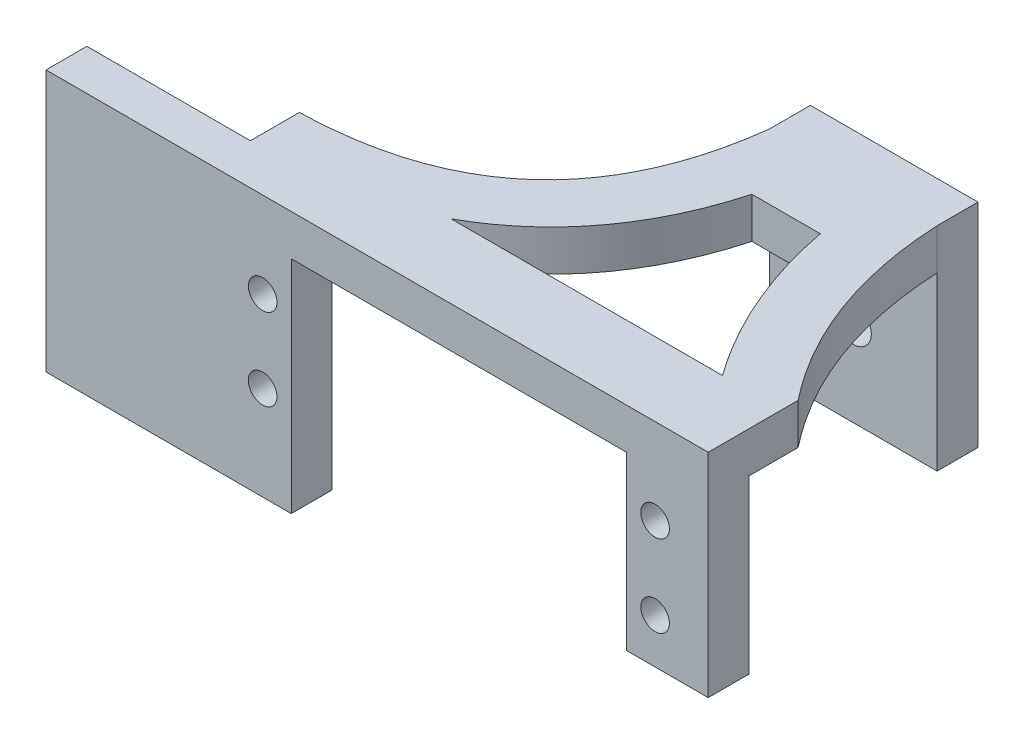
ISO-10303-21;
HEADER;
FILE_DESCRIPTION(('STEP AP214'),'2;1');
FILE_NAME('part.step','',(''),(''),'','','');
FILE_SCHEMA(('AUTOMOTIVE_DESIGN { 1 0 10303 214 1 1 1 1 }'));
ENDSEC;
DATA;
#1=APPLICATION_CONTEXT('core data for automotive mechanical design processes');
#2=APPLICATION_PROTOCOL_DEFINITION('international standard','automotive_design',2000,#1);
#3=PRODUCT_CONTEXT('',#1,'mechanical');
#4=PRODUCT('Part','Part','',(#3));
#5=PRODUCT_RELATED_PRODUCT_CATEGORY('part','',(#4));
#6=PRODUCT_DEFINITION_FORMATION('','',#4);
#7=PRODUCT_DEFINITION_CONTEXT('part definition',#1,'design');
#8=PRODUCT_DEFINITION('design','',#6,#7);
#9=PRODUCT_DEFINITION_SHAPE('','',#8);
#10=(LENGTH_UNIT() NAMED_UNIT(*) SI_UNIT(.MILLI.,.METRE.));
#11=(NAMED_UNIT(*) PLANE_ANGLE_UNIT() SI_UNIT($,.RADIAN.));
#12=(NAMED_UNIT(*) SI_UNIT($,.STERADIAN.) SOLID_ANGLE_UNIT());
#13=UNCERTAINTY_MEASURE_WITH_UNIT(LENGTH_MEASURE(1.E-05),#10,'distance_accuracy_value','');
#14=(GEOMETRIC_REPRESENTATION_CONTEXT(3) GLOBAL_UNCERTAINTY_ASSIGNED_CONTEXT((#13)) GLOBAL_UNIT_ASSIGNED_CONTEXT((#10,
#11,#12)) REPRESENTATION_CONTEXT('',''));
#15=CARTESIAN_POINT('',(0.,0.,0.));
#16=DIRECTION('',(0.,0.,1.));
#17=DIRECTION('',(1.,0.,0.));
#18=AXIS2_PLACEMENT_3D('',#15,#16,#17);
#19=CARTESIAN_POINT('',(-5.,21.,2.5));
#20=DIRECTION('',(1.,0.,0.));
#21=DIRECTION('',(0.,0.,-1.));
#22=AXIS2_PLACEMENT_3D('',#19,#20,#21);
#23=PLANE('',#22);
#24=DIRECTION('',(0.,-1.,0.));
#25=VECTOR('',#24,1.);
#26=CARTESIAN_POINT('',(-5.,-6.,-2.5));
#27=LINE('',#26,#25);
#28=CARTESIAN_POINT('',(-5.,26.,-2.5));
#29=VERTEX_POINT('',#28);
#30=CARTESIAN_POINT('',(-5.,21.,-2.5));
#31=VERTEX_POINT('',#30);
#32=EDGE_CURVE('E125',#29,#31,#27,.T.);
#33=ORIENTED_EDGE('',*,*,#32,.F.);
#34=DIRECTION('',(0.,0.,1.));
#35=VECTOR('',#34,1.);
#36=CARTESIAN_POINT('',(-5.,26.,-40.5));
#37=LINE('',#36,#35);
#38=CARTESIAN_POINT('',(-5.,26.,-8.5));
#39=VERTEX_POINT('',#38);
#40=EDGE_CURVE('E462',#39,#29,#37,.T.);
#41=ORIENTED_EDGE('',*,*,#40,.F.);
#42=DIRECTION('',(0.,-1.,0.));
#43=VECTOR('',#42,1.);
#44=CARTESIAN_POINT('',(-5.,26.001,-8.5));
#45=LINE('',#44,#43);
#46=CARTESIAN_POINT('',(-5.,21.,-8.5));
#47=VERTEX_POINT('',#46);
#48=EDGE_CURVE('E369',#39,#47,#45,.T.);
#49=ORIENTED_EDGE('',*,*,#48,.T.);
#50=DIRECTION('',(0.,0.,1.));
#51=VECTOR('',#50,1.);
#52=CARTESIAN_POINT('',(-5.,21.,-40.5));
#53=LINE('',#52,#51);
#54=EDGE_CURVE('E461',#47,#31,#53,.T.);
#55=ORIENTED_EDGE('',*,*,#54,.T.);
#56=EDGE_LOOP('',(#33,#41,#49,#55));
#57=FACE_BOUND('',#56,.T.);
#58=ADVANCED_FACE('F110',(#57),#23,.F.);
#59=CARTESIAN_POINT('',(0.,21.,0.));
#60=DIRECTION('',(0.,1.,0.));
#61=DIRECTION('',(0.,0.,1.));
#62=AXIS2_PLACEMENT_3D('',#59,#60,#61);
#63=PLANE('',#62);
#64=CARTESIAN_POINT('',(38.7838628851176,21.,-35.114936140948));
#65=CARTESIAN_POINT('',(38.8652918877911,21.,-33.6852308442561));
#66=CARTESIAN_POINT('',(39.1304437659804,21.,-30.8162649095763));
#67=CARTESIAN_POINT('',(40.0657359277435,21.,-25.2463809760036));
#68=CARTESIAN_POINT('',(42.0094454296501,21.,-18.532642769764));
#69=CARTESIAN_POINT('',(44.9880888737021,21.,-12.248553285696));
#70=CARTESIAN_POINT('',(47.9623960815902,21.,-7.52591231067879));
#71=CARTESIAN_POINT('',(49.6508214629412,21.,-5.25850875930615));
#72=CARTESIAN_POINT('',(50.5332752535796,21.,-4.16214311814657));
#73=B_SPLINE_CURVE_WITH_KNOTS('',3,(#64,#65,#66,#67,#68,#69,#70,#71,#72),.UNSPECIFIED.,.F.,.F.,
(4,1,1,1,1,1,4),(0.,0.125,0.25,0.5,0.75,0.875,1.),.UNSPECIFIED.);
#74=CARTESIAN_POINT('',(39.7152079045657,21.,-27.5));
#75=VERTEX_POINT('',#74);
#76=CARTESIAN_POINT('',(48.7510362250685,21.,-6.5));
#77=VERTEX_POINT('',#76);
#78=EDGE_CURVE('E544',#75,#77,#73,.T.);
#79=ORIENTED_EDGE('',*,*,#78,.F.);
#80=DIRECTION('',(1.,0.,0.));
#81=VECTOR('',#80,1.);
#82=CARTESIAN_POINT('',(0.,21.,-27.5));
#83=LINE('',#82,#81);
#84=CARTESIAN_POINT('',(31.3438963494135,21.,-27.5));
#85=VERTEX_POINT('',#84);
#86=EDGE_CURVE('E133',#85,#75,#83,.T.);
#87=ORIENTED_EDGE('',*,*,#86,.F.);
#88=CARTESIAN_POINT('',(32.73683878152,21.,-34.5383919550423));
#89=CARTESIAN_POINT('',(32.5797981224586,21.,-33.3230631134089));
#90=CARTESIAN_POINT('',(32.1839084465509,21.,-30.8762568893279));
#91=CARTESIAN_POINT('',(31.092947724213,21.,-26.2509816916951));
#92=CARTESIAN_POINT('',(29.1168839979073,21.,-20.8255396942699));
#93=CARTESIAN_POINT('',(25.6747922132707,21.,-15.0245460899033));
#94=CARTESIAN_POINT('',(21.1403736095319,21.,-10.111116834161));
#95=CARTESIAN_POINT('',(15.6453147543688,21.,-6.28918660899113));
#96=CARTESIAN_POINT('',(10.4487369566814,21.,-4.07506504000657));
#97=CARTESIAN_POINT('',(6.00171909105598,21.,-2.85509985059111));
#98=CARTESIAN_POINT('',(2.53152841911866,21.,-2.2019378239847));
#99=CARTESIAN_POINT('',(-0.471207100711964,21.,-1.86496619572558));
#100=CARTESIAN_POINT('',(-2.93304743004251,21.,-1.71384560274864));
#101=CARTESIAN_POINT('',(-4.19526220151115,21.,-1.6767410135728));
#102=CARTESIAN_POINT('',(-4.82277343746924,21.,-1.66776347679863));
#103=B_SPLINE_CURVE_WITH_KNOTS('',3,(#88,#89,#90,#91,#92,#93,#94,#95,#96,#97,#98,#99,#100,#101,
#102),.UNSPECIFIED.,.F.,.F.,(4,1,1,1,1,1,1,1,1,1,1,1,4),(0.,0.0625,0.125,0.25,0.375,0.5,0.625,
0.75,0.8125,0.875,0.9375,0.96875,1.),.UNSPECIFIED.);
#104=CARTESIAN_POINT('',(15.5519508130954,21.,-6.5));
#105=VERTEX_POINT('',#104);
#106=EDGE_CURVE('E531',#85,#105,#103,.T.);
#107=ORIENTED_EDGE('',*,*,#106,.T.);
#108=DIRECTION('',(-1.,0.,0.));
#109=VECTOR('',#108,1.);
#110=CARTESIAN_POINT('',(0.,21.,-6.5));
#111=LINE('',#110,#109);
#112=EDGE_CURVE('E538',#77,#105,#111,.T.);
#113=ORIENTED_EDGE('',*,*,#112,.F.);
#114=EDGE_LOOP('',(#79,#87,#107,#113));
#115=FACE_BOUND('',#114,.T.);
#116=CARTESIAN_POINT('',(46.,21.,-35.5));
#117=CARTESIAN_POINT('',(46.7615392515143,21.,-20.1514583464889));
#118=CARTESIAN_POINT('',(56.,21.,-8.49999999999999));
#119=B_SPLINE_CURVE_WITH_KNOTS('',2,(#116,#117,#118),.UNSPECIFIED.,.F.,.F.,(3,3),(0.,1.),.UNSPECIFIED.);
#120=CARTESIAN_POINT('',(46.,21.,-35.5));
#121=VERTEX_POINT('',#120);
#122=CARTESIAN_POINT('',(56.,21.,-8.49999999999999));
#123=VERTEX_POINT('',#122);
#124=EDGE_CURVE('E336',#121,#123,#119,.T.);
#125=ORIENTED_EDGE('',*,*,#124,.T.);
#126=DIRECTION('',(0.,0.,-1.));
#127=VECTOR('',#126,1.);
#128=CARTESIAN_POINT('',(56.,21.,2.5));
#129=LINE('',#128,#127);
#130=CARTESIAN_POINT('',(56.,21.,-2.5));
#131=VERTEX_POINT('',#130);
#132=EDGE_CURVE('E465',#131,#123,#129,.T.);
#133=ORIENTED_EDGE('',*,*,#132,.F.);
#134=DIRECTION('',(-1.,0.,0.));
#135=VECTOR('',#134,1.);
#136=CARTESIAN_POINT('',(46.,21.,-2.5));
#137=LINE('',#136,#135);
#138=CARTESIAN_POINT('',(46.,21.,-2.5));
#139=VERTEX_POINT('',#138);
#140=EDGE_CURVE('E437',#131,#139,#137,.T.);
#141=ORIENTED_EDGE('',*,*,#140,.T.);
#142=DIRECTION('',(0.,0.,1.));
#143=VECTOR('',#142,1.);
#144=CARTESIAN_POINT('',(46.,21.,2.5));
#145=LINE('',#144,#143);
#146=CARTESIAN_POINT('',(46.,21.,2.5));
#147=VERTEX_POINT('',#146);
#148=EDGE_CURVE('E440',#139,#147,#145,.T.);
#149=ORIENTED_EDGE('',*,*,#148,.T.);
#150=DIRECTION('',(1.,0.,0.));
#151=VECTOR('',#150,1.);
#152=CARTESIAN_POINT('',(-5.,21.,2.5));
#153=LINE('',#152,#151);
#154=CARTESIAN_POINT('',(5.,21.,2.5));
#155=VERTEX_POINT('',#154);
#156=EDGE_CURVE('E475',#155,#147,#153,.T.);
#157=ORIENTED_EDGE('',*,*,#156,.F.);
#158=DIRECTION('',(0.,0.,-1.));
#159=VECTOR('',#158,1.);
#160=CARTESIAN_POINT('',(5.,21.,2.5));
#161=LINE('',#160,#159);
#162=CARTESIAN_POINT('',(5.,21.,-2.5));
#163=VERTEX_POINT('',#162);
#164=EDGE_CURVE('E481',#155,#163,#161,.T.);
#165=ORIENTED_EDGE('',*,*,#164,.T.);
#166=DIRECTION('',(-1.,0.,0.));
#167=VECTOR('',#166,1.);
#168=CARTESIAN_POINT('',(-5.,21.,-2.5));
#169=LINE('',#168,#167);
#170=EDGE_CURVE('E253',#163,#31,#169,.T.);
#171=ORIENTED_EDGE('',*,*,#170,.T.);
#172=ORIENTED_EDGE('',*,*,#54,.F.);
#173=CARTESIAN_POINT('',(25.5,21.,-35.5));
#174=CARTESIAN_POINT('',(22.3071940127314,21.,-9.11182757343748));
#175=CARTESIAN_POINT('',(-5.,21.,-8.5));
#176=B_SPLINE_CURVE_WITH_KNOTS('',2,(#173,#174,#175),.UNSPECIFIED.,.F.,.F.,(3,3),(0.,1.),.UNSPECIFIED.);
#177=CARTESIAN_POINT('',(25.5,21.,-35.5));
#178=VERTEX_POINT('',#177);
#179=EDGE_CURVE('E357',#178,#47,#176,.T.);
#180=ORIENTED_EDGE('',*,*,#179,.F.);
#181=DIRECTION('',(-1.,0.,0.));
#182=VECTOR('',#181,1.);
#183=CARTESIAN_POINT('',(46.,21.,-35.5));
#184=LINE('',#183,#182);
#185=EDGE_CURVE('E414',#121,#178,#184,.T.);
#186=ORIENTED_EDGE('',*,*,#185,.F.);
#187=EDGE_LOOP('',(#125,#133,#141,#149,#157,#165,#171,#172,#180,#186));
#188=FACE_BOUND('',#187,.T.);
#189=ADVANCED_FACE('F485',(#115,#188),#63,.F.);
#190=CARTESIAN_POINT('',(56.,26.,2.5));
#191=DIRECTION('',(-1.,0.,0.));
#192=DIRECTION('',(0.,0.,1.));
#193=AXIS2_PLACEMENT_3D('',#190,#191,#192);
#194=PLANE('',#193);
#195=DIRECTION('',(0.,-1.,0.));
#196=VECTOR('',#195,1.);
#197=CARTESIAN_POINT('',(56.,26.001,-8.49999999999999));
#198=LINE('',#197,#196);
#199=CARTESIAN_POINT('',(56.,26.,-8.49999999999999));
#200=VERTEX_POINT('',#199);
#201=EDGE_CURVE('E345',#200,#123,#198,.T.);
#202=ORIENTED_EDGE('',*,*,#201,.F.);
#203=DIRECTION('',(0.,0.,-1.));
#204=VECTOR('',#203,1.);
#205=CARTESIAN_POINT('',(56.,26.,2.5));
#206=LINE('',#205,#204);
#207=CARTESIAN_POINT('',(56.,26.,2.5));
#208=VERTEX_POINT('',#207);
#209=EDGE_CURVE('E467',#208,#200,#206,.T.);
#210=ORIENTED_EDGE('',*,*,#209,.F.);
#211=DIRECTION('',(0.,-1.,0.));
#212=VECTOR('',#211,1.);
#213=CARTESIAN_POINT('',(56.,26.,2.5));
#214=LINE('',#213,#212);
#215=CARTESIAN_POINT('',(56.,0.,2.5));
#216=VERTEX_POINT('',#215);
#217=EDGE_CURVE('E473',#208,#216,#214,.T.);
#218=ORIENTED_EDGE('',*,*,#217,.T.);
#219=DIRECTION('',(0.,0.,-1.));
#220=VECTOR('',#219,1.);
#221=CARTESIAN_POINT('',(56.,0.,2.5));
#222=LINE('',#221,#220);
#223=CARTESIAN_POINT('',(56.,0.,-2.5));
#224=VERTEX_POINT('',#223);
#225=EDGE_CURVE('E436',#216,#224,#222,.T.);
#226=ORIENTED_EDGE('',*,*,#225,.T.);
#227=DIRECTION('',(0.,-1.,0.));
#228=VECTOR('',#227,1.);
#229=CARTESIAN_POINT('',(56.,21.,-2.5));
#230=LINE('',#229,#228);
#231=EDGE_CURVE('E458',#131,#224,#230,.T.);
#232=ORIENTED_EDGE('',*,*,#231,.F.);
#233=ORIENTED_EDGE('',*,*,#132,.T.);
#234=EDGE_LOOP('',(#202,#210,#218,#226,#232,#233));
#235=FACE_BOUND('',#234,.T.);
#236=ADVANCED_FACE('F571',(#235),#194,.F.);
#237=CARTESIAN_POINT('',(0.,26.,0.));
#238=DIRECTION('',(0.,1.,0.));
#239=DIRECTION('',(0.,0.,1.));
#240=AXIS2_PLACEMENT_3D('',#237,#238,#239);
#241=PLANE('',#240);
#242=DIRECTION('',(1.,0.,0.));
#243=VECTOR('',#242,1.);
#244=CARTESIAN_POINT('',(0.,26.,-27.5));
#245=LINE('',#244,#243);
#246=CARTESIAN_POINT('',(31.3438963494135,26.,-27.5));
#247=VERTEX_POINT('',#246);
#248=CARTESIAN_POINT('',(39.7152079045657,26.,-27.5));
#249=VERTEX_POINT('',#248);
#250=EDGE_CURVE('E290',#247,#249,#245,.T.);
#251=ORIENTED_EDGE('',*,*,#250,.T.);
#252=CARTESIAN_POINT('',(38.7838628851176,26.,-35.114936140948));
#253=CARTESIAN_POINT('',(38.8652918877911,26.,-33.6852308442561));
#254=CARTESIAN_POINT('',(39.1304437659804,26.,-30.8162649095763));
#255=CARTESIAN_POINT('',(40.0657359277435,26.,-25.2463809760036));
#256=CARTESIAN_POINT('',(42.0094454296501,26.,-18.532642769764));
#257=CARTESIAN_POINT('',(44.9880888737021,26.,-12.248553285696));
#258=CARTESIAN_POINT('',(47.9623960815902,26.,-7.52591231067879));
#259=CARTESIAN_POINT('',(49.6508214629412,26.,-5.25850875930615));
#260=CARTESIAN_POINT('',(50.5332752535796,26.,-4.16214311814657));
#261=B_SPLINE_CURVE_WITH_KNOTS('',3,(#252,#253,#254,#255,#256,#257,#258,#259,#260),
.UNSPECIFIED.,.F.,.F.,(4,1,1,1,1,1,4),(0.,0.125,0.25,0.5,0.75,0.875,1.),.UNSPECIFIED.);
#262=CARTESIAN_POINT('',(48.7510362250686,26.,-6.5));
#263=VERTEX_POINT('',#262);
#264=EDGE_CURVE('E516',#249,#263,#261,.T.);
#265=ORIENTED_EDGE('',*,*,#264,.T.);
#266=DIRECTION('',(-1.,0.,0.));
#267=VECTOR('',#266,1.);
#268=CARTESIAN_POINT('',(0.,26.,-6.5));
#269=LINE('',#268,#267);
#270=CARTESIAN_POINT('',(15.5519508130954,26.,-6.5));
#271=VERTEX_POINT('',#270);
#272=EDGE_CURVE('E265',#263,#271,#269,.T.);
#273=ORIENTED_EDGE('',*,*,#272,.T.);
#274=CARTESIAN_POINT('',(32.73683878152,26.,-34.5383919550423));
#275=CARTESIAN_POINT('',(32.5797981224586,26.,-33.3230631134089));
#276=CARTESIAN_POINT('',(32.1839084465509,26.,-30.8762568893279));
#277=CARTESIAN_POINT('',(31.092947724213,26.,-26.2509816916951));
#278=CARTESIAN_POINT('',(29.1168839979073,26.,-20.8255396942699));
#279=CARTESIAN_POINT('',(25.6747922132707,26.,-15.0245460899033));
#280=CARTESIAN_POINT('',(21.1403736095319,26.,-10.111116834161));
#281=CARTESIAN_POINT('',(15.6453147543688,26.,-6.28918660899113));
#282=CARTESIAN_POINT('',(10.4487369566814,26.,-4.07506504000657));
#283=CARTESIAN_POINT('',(6.00171909105598,26.,-2.85509985059111));
#284=CARTESIAN_POINT('',(2.53152841911866,26.,-2.2019378239847));
#285=CARTESIAN_POINT('',(-0.471207100711964,26.,-1.86496619572558));
#286=CARTESIAN_POINT('',(-2.93304743004251,26.,-1.71384560274864));
#287=CARTESIAN_POINT('',(-4.19526220151115,26.,-1.6767410135728));
#288=CARTESIAN_POINT('',(-4.82277343746924,26.,-1.66776347679863));
#289=B_SPLINE_CURVE_WITH_KNOTS('',3,(#274,#275,#276,#277,#278,#279,#280,#281,#282,#283,#284,
#285,#286,#287,#288),.UNSPECIFIED.,.F.,.F.,(4,1,1,1,1,1,1,1,1,1,1,1,4),(0.,0.0625,0.125,0.25,
0.375,0.5,0.625,0.75,0.8125,0.875,0.9375,0.96875,1.),.UNSPECIFIED.);
#290=EDGE_CURVE('E286',#247,#271,#289,.T.);
#291=ORIENTED_EDGE('',*,*,#290,.F.);
#292=EDGE_LOOP('',(#251,#265,#273,#291));
#293=FACE_BOUND('',#292,.T.);
#294=ORIENTED_EDGE('',*,*,#209,.T.);
#295=CARTESIAN_POINT('',(46.,26.,-35.5));
#296=CARTESIAN_POINT('',(46.7615392515143,26.,-20.1514583464889));
#297=CARTESIAN_POINT('',(56.,26.,-8.49999999999999));
#298=B_SPLINE_CURVE_WITH_KNOTS('',2,(#295,#296,#297),.UNSPECIFIED.,.F.,.F.,(3,3),(0.,1.),.UNSPECIFIED.);
#299=CARTESIAN_POINT('',(46.,26.,-35.5));
#300=VERTEX_POINT('',#299);
#301=EDGE_CURVE('E332',#300,#200,#298,.T.);
#302=ORIENTED_EDGE('',*,*,#301,.F.);
#303=DIRECTION('',(0.,0.,-1.));
#304=VECTOR('',#303,1.);
#305=CARTESIAN_POINT('',(46.,26.,0.));
#306=LINE('',#305,#304);
#307=CARTESIAN_POINT('',(46.,26.,-40.5));
#308=VERTEX_POINT('',#307);
#309=EDGE_CURVE('E350',#300,#308,#306,.T.);
#310=ORIENTED_EDGE('',*,*,#309,.T.);
#311=DIRECTION('',(-1.,0.,0.));
#312=VECTOR('',#311,1.);
#313=CARTESIAN_POINT('',(56.,26.,-40.5));
#314=LINE('',#313,#312);
#315=CARTESIAN_POINT('',(25.5,26.,-40.5));
#316=VERTEX_POINT('',#315);
#317=EDGE_CURVE('E470',#308,#316,#314,.T.);
#318=ORIENTED_EDGE('',*,*,#317,.T.);
#319=DIRECTION('',(0.,0.,1.));
#320=VECTOR('',#319,1.);
#321=CARTESIAN_POINT('',(25.5,26.,0.));
#322=LINE('',#321,#320);
#323=CARTESIAN_POINT('',(25.5,26.,-35.5));
#324=VERTEX_POINT('',#323);
#325=EDGE_CURVE('E355',#316,#324,#322,.T.);
#326=ORIENTED_EDGE('',*,*,#325,.T.);
#327=CARTESIAN_POINT('',(25.5,26.,-35.5));
#328=CARTESIAN_POINT('',(22.3071940127314,26.,-9.11182757343748));
#329=CARTESIAN_POINT('',(-5.,26.,-8.5));
#330=B_SPLINE_CURVE_WITH_KNOTS('',2,(#327,#328,#329),.UNSPECIFIED.,.F.,.F.,(3,3),(0.,1.),.UNSPECIFIED.);
#331=EDGE_CURVE('E375',#324,#39,#330,.T.);
#332=ORIENTED_EDGE('',*,*,#331,.T.);
#333=ORIENTED_EDGE('',*,*,#40,.T.);
#334=DIRECTION('',(1.,0.,0.));
#335=VECTOR('',#334,1.);
#336=CARTESIAN_POINT('',(-25.,26.,-2.5));
#337=LINE('',#336,#335);
#338=CARTESIAN_POINT('',(-25.,26.,-2.5));
#339=VERTEX_POINT('',#338);
#340=EDGE_CURVE('E279',#339,#29,#337,.T.);
#341=ORIENTED_EDGE('',*,*,#340,.F.);
#342=DIRECTION('',(0.,0.,-1.));
#343=VECTOR('',#342,1.);
#344=CARTESIAN_POINT('',(-25.,26.,-2.5));
#345=LINE('',#344,#343);
#346=CARTESIAN_POINT('',(-25.,26.,2.5));
#347=VERTEX_POINT('',#346);
#348=EDGE_CURVE('E278',#347,#339,#345,.T.);
#349=ORIENTED_EDGE('',*,*,#348,.F.);
#350=DIRECTION('',(1.,0.,0.));
#351=VECTOR('',#350,1.);
#352=CARTESIAN_POINT('',(-5.,26.,2.5));
#353=LINE('',#352,#351);
#354=EDGE_CURVE('E464',#347,#208,#353,.T.);
#355=ORIENTED_EDGE('',*,*,#354,.T.);
#356=EDGE_LOOP('',(#294,#302,#310,#318,#326,#332,#333,#341,#349,#355));
#357=FACE_BOUND('',#356,.T.);
#358=ADVANCED_FACE('F491',(#293,#357),#241,.T.);
#359=CARTESIAN_POINT('',(5.,21.,2.5));
#360=DIRECTION('',(-1.,0.,0.));
#361=DIRECTION('',(0.,0.,1.));
#362=AXIS2_PLACEMENT_3D('',#359,#360,#361);
#363=PLANE('',#362);
#364=DIRECTION('',(0.,-1.,0.));
#365=VECTOR('',#364,1.);
#366=CARTESIAN_POINT('',(5.,21.,2.5));
#367=LINE('',#366,#365);
#368=CARTESIAN_POINT('',(5.,-6.,2.5));
#369=VERTEX_POINT('',#368);
#370=EDGE_CURVE('E118',#155,#369,#367,.T.);
#371=ORIENTED_EDGE('',*,*,#370,.T.);
#372=DIRECTION('',(0.,0.,-1.));
#373=VECTOR('',#372,1.);
#374=CARTESIAN_POINT('',(5.,-6.,-2.5));
#375=LINE('',#374,#373);
#376=CARTESIAN_POINT('',(5.,-6.,-2.5));
#377=VERTEX_POINT('',#376);
#378=EDGE_CURVE('E262',#369,#377,#375,.T.);
#379=ORIENTED_EDGE('',*,*,#378,.T.);
#380=DIRECTION('',(0.,-1.,0.));
#381=VECTOR('',#380,1.);
#382=CARTESIAN_POINT('',(5.,21.,-2.5));
#383=LINE('',#382,#381);
#384=EDGE_CURVE('E12',#163,#377,#383,.T.);
#385=ORIENTED_EDGE('',*,*,#384,.F.);
#386=ORIENTED_EDGE('',*,*,#164,.F.);
#387=EDGE_LOOP('',(#371,#379,#385,#386));
#388=FACE_BOUND('',#387,.T.);
#389=ADVANCED_FACE('F112',(#388),#363,.F.);
#390=CARTESIAN_POINT('',(-5.,21.,-2.5));
#391=DIRECTION('',(0.,0.,1.));
#392=DIRECTION('',(1.,0.,0.));
#393=AXIS2_PLACEMENT_3D('',#390,#391,#392);
#394=PLANE('',#393);
#395=CARTESIAN_POINT('',(1.5000000000001,5.5,-2.5));
#396=DIRECTION('',(0.,0.,1.));
#397=DIRECTION('',(1.,0.,0.));
#398=AXIS2_PLACEMENT_3D('',#395,#396,#397);
#399=CIRCLE('',#398,1.75);
#400=CARTESIAN_POINT('',(3.25000000000011,5.5,-2.5));
#401=VERTEX_POINT('',#400);
#402=EDGE_CURVE('E396',#401,#401,#399,.F.);
#403=ORIENTED_EDGE('',*,*,#402,.F.);
#404=EDGE_LOOP('',(#403));
#405=FACE_BOUND('',#404,.T.);
#406=CARTESIAN_POINT('',(1.5,15.5,-2.5));
#407=DIRECTION('',(0.,0.,1.));
#408=DIRECTION('',(1.,0.,0.));
#409=AXIS2_PLACEMENT_3D('',#406,#407,#408);
#410=CIRCLE('',#409,1.75);
#411=CARTESIAN_POINT('',(3.25,15.5,-2.5));
#412=VERTEX_POINT('',#411);
#413=EDGE_CURVE('E405',#412,#412,#410,.F.);
#414=ORIENTED_EDGE('',*,*,#413,.F.);
#415=EDGE_LOOP('',(#414));
#416=FACE_BOUND('',#415,.T.);
#417=ORIENTED_EDGE('',*,*,#384,.T.);
#418=DIRECTION('',(1.,0.,0.));
#419=VECTOR('',#418,1.);
#420=CARTESIAN_POINT('',(-25.,-6.,-2.5));
#421=LINE('',#420,#419);
#422=CARTESIAN_POINT('',(-25.,-6.,-2.5));
#423=VERTEX_POINT('',#422);
#424=EDGE_CURVE('E251',#423,#377,#421,.T.);
#425=ORIENTED_EDGE('',*,*,#424,.F.);
#426=DIRECTION('',(0.,-1.,0.));
#427=VECTOR('',#426,1.);
#428=CARTESIAN_POINT('',(-25.,-6.,-2.5));
#429=LINE('',#428,#427);
#430=EDGE_CURVE('E270',#339,#423,#429,.T.);
#431=ORIENTED_EDGE('',*,*,#430,.F.);
#432=ORIENTED_EDGE('',*,*,#340,.T.);
#433=ORIENTED_EDGE('',*,*,#32,.T.);
#434=ORIENTED_EDGE('',*,*,#170,.F.);
#435=EDGE_LOOP('',(#417,#425,#431,#432,#433,#434));
#436=FACE_BOUND('',#435,.T.);
#437=ADVANCED_FACE('F249',(#405,#416,#436),#394,.F.);
#438=CARTESIAN_POINT('',(-5.,21.,2.5));
#439=DIRECTION('',(0.,0.,-1.));
#440=DIRECTION('',(-1.,0.,0.));
#441=AXIS2_PLACEMENT_3D('',#438,#439,#440);
#442=PLANE('',#441);
#443=DIRECTION('',(1.,0.,0.));
#444=VECTOR('',#443,1.);
#445=CARTESIAN_POINT('',(-25.,-6.,2.5));
#446=LINE('',#445,#444);
#447=CARTESIAN_POINT('',(-25.,-6.,2.5));
#448=VERTEX_POINT('',#447);
#449=EDGE_CURVE('E266',#448,#369,#446,.T.);
#450=ORIENTED_EDGE('',*,*,#449,.T.);
#451=ORIENTED_EDGE('',*,*,#370,.F.);
#452=ORIENTED_EDGE('',*,*,#156,.T.);
#453=DIRECTION('',(0.,-1.,0.));
#454=VECTOR('',#453,1.);
#455=CARTESIAN_POINT('',(46.,21.,2.5));
#456=LINE('',#455,#454);
#457=CARTESIAN_POINT('',(46.,0.,2.5));
#458=VERTEX_POINT('',#457);
#459=EDGE_CURVE('E444',#147,#458,#456,.T.);
#460=ORIENTED_EDGE('',*,*,#459,.T.);
#461=DIRECTION('',(1.,0.,0.));
#462=VECTOR('',#461,1.);
#463=CARTESIAN_POINT('',(46.,0.,2.5));
#464=LINE('',#463,#462);
#465=EDGE_CURVE('E441',#458,#216,#464,.T.);
#466=ORIENTED_EDGE('',*,*,#465,.T.);
#467=ORIENTED_EDGE('',*,*,#217,.F.);
#468=ORIENTED_EDGE('',*,*,#354,.F.);
#469=DIRECTION('',(0.,1.,0.));
#470=VECTOR('',#469,1.);
#471=CARTESIAN_POINT('',(-25.,-6.,2.5));
#472=LINE('',#471,#470);
#473=EDGE_CURVE('E275',#448,#347,#472,.T.);
#474=ORIENTED_EDGE('',*,*,#473,.F.);
#475=EDGE_LOOP('',(#450,#451,#452,#460,#466,#467,#468,#474));
#476=FACE_BOUND('',#475,.T.);
#477=CARTESIAN_POINT('',(1.5000000000001,5.5,2.5));
#478=DIRECTION('',(0.,0.,1.));
#479=DIRECTION('',(1.,0.,0.));
#480=AXIS2_PLACEMENT_3D('',#477,#478,#479);
#481=CIRCLE('',#480,1.75);
#482=CARTESIAN_POINT('',(3.25000000000011,5.5,2.5));
#483=VERTEX_POINT('',#482);
#484=EDGE_CURVE('E381',#483,#483,#481,.T.);
#485=ORIENTED_EDGE('',*,*,#484,.F.);
#486=EDGE_LOOP('',(#485));
#487=FACE_BOUND('',#486,.T.);
#488=CARTESIAN_POINT('',(49.5000000000001,5.5,2.5));
#489=DIRECTION('',(0.,0.,1.));
#490=DIRECTION('',(1.,0.,0.));
#491=AXIS2_PLACEMENT_3D('',#488,#489,#490);
#492=CIRCLE('',#491,1.75);
#493=CARTESIAN_POINT('',(51.2500000000001,5.5,2.5));
#494=VERTEX_POINT('',#493);
#495=EDGE_CURVE('E393',#494,#494,#492,.T.);
#496=ORIENTED_EDGE('',*,*,#495,.F.);
#497=EDGE_LOOP('',(#496));
#498=FACE_BOUND('',#497,.T.);
#499=CARTESIAN_POINT('',(49.5,15.5,2.5));
#500=DIRECTION('',(0.,0.,1.));
#501=DIRECTION('',(1.,0.,0.));
#502=AXIS2_PLACEMENT_3D('',#499,#500,#501);
#503=CIRCLE('',#502,1.75);
#504=CARTESIAN_POINT('',(51.25,15.5,2.5));
#505=VERTEX_POINT('',#504);
#506=EDGE_CURVE('E382',#505,#505,#503,.T.);
#507=ORIENTED_EDGE('',*,*,#506,.F.);
#508=EDGE_LOOP('',(#507));
#509=FACE_BOUND('',#508,.T.);
#510=CARTESIAN_POINT('',(1.5,15.5,2.5));
#511=DIRECTION('',(0.,0.,1.));
#512=DIRECTION('',(1.,0.,0.));
#513=AXIS2_PLACEMENT_3D('',#510,#511,#512);
#514=CIRCLE('',#513,1.75);
#515=CARTESIAN_POINT('',(3.25,15.5,2.5));
#516=VERTEX_POINT('',#515);
#517=EDGE_CURVE('E392',#516,#516,#514,.T.);
#518=ORIENTED_EDGE('',*,*,#517,.F.);
#519=EDGE_LOOP('',(#518));
#520=FACE_BOUND('',#519,.T.);
#521=ADVANCED_FACE('F574',(#476,#487,#498,#509,#520),#442,.F.);
#522=CARTESIAN_POINT('',(56.,26.,-40.5));
#523=DIRECTION('',(0.,0.,1.));
#524=DIRECTION('',(1.,0.,0.));
#525=AXIS2_PLACEMENT_3D('',#522,#523,#524);
#526=PLANE('',#525);
#527=CARTESIAN_POINT('',(35.75,10.5,-40.5));
#528=DIRECTION('',(0.,0.,1.));
#529=DIRECTION('',(1.,0.,0.));
#530=AXIS2_PLACEMENT_3D('',#527,#528,#529);
#531=CIRCLE('',#530,2.2);
#532=CARTESIAN_POINT('',(37.95,10.5,-40.5));
#533=VERTEX_POINT('',#532);
#534=EDGE_CURVE('E411',#533,#533,#531,.F.);
#535=ORIENTED_EDGE('',*,*,#534,.F.);
#536=EDGE_LOOP('',(#535));
#537=FACE_BOUND('',#536,.T.);
#538=ORIENTED_EDGE('',*,*,#317,.F.);
#539=DIRECTION('',(0.,1.,0.));
#540=VECTOR('',#539,1.);
#541=CARTESIAN_POINT('',(46.,0.,-40.5));
#542=LINE('',#541,#540);
#543=CARTESIAN_POINT('',(46.,0.,-40.5));
#544=VERTEX_POINT('',#543);
#545=EDGE_CURVE('E424',#544,#308,#542,.T.);
#546=ORIENTED_EDGE('',*,*,#545,.F.);
#547=DIRECTION('',(1.,0.,0.));
#548=VECTOR('',#547,1.);
#549=CARTESIAN_POINT('',(46.,0.,-40.5));
#550=LINE('',#549,#548);
#551=CARTESIAN_POINT('',(25.5,0.,-40.5));
#552=VERTEX_POINT('',#551);
#553=EDGE_CURVE('E422',#552,#544,#550,.T.);
#554=ORIENTED_EDGE('',*,*,#553,.F.);
#555=DIRECTION('',(0.,1.,0.));
#556=VECTOR('',#555,1.);
#557=CARTESIAN_POINT('',(25.5,0.,-40.5));
#558=LINE('',#557,#556);
#559=EDGE_CURVE('E428',#552,#316,#558,.T.);
#560=ORIENTED_EDGE('',*,*,#559,.T.);
#561=EDGE_LOOP('',(#538,#546,#554,#560));
#562=FACE_BOUND('',#561,.T.);
#563=ADVANCED_FACE('F582',(#537,#562),#526,.F.);
#564=CARTESIAN_POINT('',(46.,21.,-2.5));
#565=DIRECTION('',(0.,0.,1.));
#566=DIRECTION('',(1.,0.,0.));
#567=AXIS2_PLACEMENT_3D('',#564,#565,#566);
#568=PLANE('',#567);
#569=CARTESIAN_POINT('',(49.5000000000001,5.5,-2.5));
#570=DIRECTION('',(0.,0.,1.));
#571=DIRECTION('',(1.,0.,0.));
#572=AXIS2_PLACEMENT_3D('',#569,#570,#571);
#573=CIRCLE('',#572,1.75);
#574=CARTESIAN_POINT('',(51.2500000000001,5.5,-2.5));
#575=VERTEX_POINT('',#574);
#576=EDGE_CURVE('E389',#575,#575,#573,.F.);
#577=ORIENTED_EDGE('',*,*,#576,.F.);
#578=EDGE_LOOP('',(#577));
#579=FACE_BOUND('',#578,.T.);
#580=CARTESIAN_POINT('',(49.5,15.5,-2.5));
#581=DIRECTION('',(0.,0.,1.));
#582=DIRECTION('',(1.,0.,0.));
#583=AXIS2_PLACEMENT_3D('',#580,#581,#582);
#584=CIRCLE('',#583,1.75);
#585=CARTESIAN_POINT('',(51.25,15.5,-2.5));
#586=VERTEX_POINT('',#585);
#587=EDGE_CURVE('E388',#586,#586,#584,.F.);
#588=ORIENTED_EDGE('',*,*,#587,.F.);
#589=EDGE_LOOP('',(#588));
#590=FACE_BOUND('',#589,.T.);
#591=DIRECTION('',(-1.,0.,0.));
#592=VECTOR('',#591,1.);
#593=CARTESIAN_POINT('',(46.,0.,-2.5));
#594=LINE('',#593,#592);
#595=CARTESIAN_POINT('',(46.,0.,-2.5));
#596=VERTEX_POINT('',#595);
#597=EDGE_CURVE('E447',#224,#596,#594,.T.);
#598=ORIENTED_EDGE('',*,*,#597,.T.);
#599=DIRECTION('',(0.,-1.,0.));
#600=VECTOR('',#599,1.);
#601=CARTESIAN_POINT('',(46.,21.,-2.5));
#602=LINE('',#601,#600);
#603=EDGE_CURVE('E455',#139,#596,#602,.T.);
#604=ORIENTED_EDGE('',*,*,#603,.F.);
#605=ORIENTED_EDGE('',*,*,#140,.F.);
#606=ORIENTED_EDGE('',*,*,#231,.T.);
#607=EDGE_LOOP('',(#598,#604,#605,#606));
#608=FACE_BOUND('',#607,.T.);
#609=ADVANCED_FACE('F624',(#579,#590,#608),#568,.F.);
#610=CARTESIAN_POINT('',(46.,21.,2.5));
#611=DIRECTION('',(1.,0.,0.));
#612=DIRECTION('',(0.,0.,-1.));
#613=AXIS2_PLACEMENT_3D('',#610,#611,#612);
#614=PLANE('',#613);
#615=DIRECTION('',(0.,0.,1.));
#616=VECTOR('',#615,1.);
#617=CARTESIAN_POINT('',(46.,0.,2.5));
#618=LINE('',#617,#616);
#619=EDGE_CURVE('E449',#596,#458,#618,.T.);
#620=ORIENTED_EDGE('',*,*,#619,.T.);
#621=ORIENTED_EDGE('',*,*,#459,.F.);
#622=ORIENTED_EDGE('',*,*,#148,.F.);
#623=ORIENTED_EDGE('',*,*,#603,.T.);
#624=EDGE_LOOP('',(#620,#621,#622,#623));
#625=FACE_BOUND('',#624,.T.);
#626=ADVANCED_FACE('F620',(#625),#614,.F.);
#627=CARTESIAN_POINT('',(0.,0.,0.));
#628=DIRECTION('',(0.,-1.,0.));
#629=DIRECTION('',(0.,0.,-1.));
#630=AXIS2_PLACEMENT_3D('',#627,#628,#629);
#631=PLANE('',#630);
#632=ORIENTED_EDGE('',*,*,#225,.F.);
#633=ORIENTED_EDGE('',*,*,#465,.F.);
#634=ORIENTED_EDGE('',*,*,#619,.F.);
#635=ORIENTED_EDGE('',*,*,#597,.F.);
#636=EDGE_LOOP('',(#632,#633,#634,#635));
#637=FACE_BOUND('',#636,.T.);
#638=ADVANCED_FACE('F617',(#637),#631,.T.);
#639=CARTESIAN_POINT('',(46.,0.,-40.5));
#640=DIRECTION('',(-1.,0.,0.));
#641=DIRECTION('',(0.,0.,1.));
#642=AXIS2_PLACEMENT_3D('',#639,#640,#641);
#643=PLANE('',#642);
#644=ORIENTED_EDGE('',*,*,#545,.T.);
#645=ORIENTED_EDGE('',*,*,#309,.F.);
#646=DIRECTION('',(0.,-1.,0.));
#647=VECTOR('',#646,1.);
#648=CARTESIAN_POINT('',(46.,26.001,-35.5));
#649=LINE('',#648,#647);
#650=EDGE_CURVE('E344',#300,#121,#649,.T.);
#651=ORIENTED_EDGE('',*,*,#650,.T.);
#652=DIRECTION('',(0.,1.,0.));
#653=VECTOR('',#652,1.);
#654=CARTESIAN_POINT('',(46.,0.,-35.5));
#655=LINE('',#654,#653);
#656=CARTESIAN_POINT('',(46.,0.,-35.5));
#657=VERTEX_POINT('',#656);
#658=EDGE_CURVE('E433',#657,#121,#655,.T.);
#659=ORIENTED_EDGE('',*,*,#658,.F.);
#660=DIRECTION('',(0.,0.,1.));
#661=VECTOR('',#660,1.);
#662=CARTESIAN_POINT('',(46.,0.,-40.5));
#663=LINE('',#662,#661);
#664=EDGE_CURVE('E415',#544,#657,#663,.T.);
#665=ORIENTED_EDGE('',*,*,#664,.F.);
#666=EDGE_LOOP('',(#644,#645,#651,#659,#665));
#667=FACE_BOUND('',#666,.T.);
#668=ADVANCED_FACE('F510',(#667),#643,.F.);
#669=CARTESIAN_POINT('',(46.,0.,-35.5));
#670=DIRECTION('',(0.,0.,-1.));
#671=DIRECTION('',(-1.,0.,0.));
#672=AXIS2_PLACEMENT_3D('',#669,#670,#671);
#673=PLANE('',#672);
#674=CARTESIAN_POINT('',(35.75,10.5,-35.5));
#675=DIRECTION('',(0.,0.,1.));
#676=DIRECTION('',(1.,0.,0.));
#677=AXIS2_PLACEMENT_3D('',#674,#675,#676);
#678=CIRCLE('',#677,2.2);
#679=CARTESIAN_POINT('',(37.95,10.5,-35.5));
#680=VERTEX_POINT('',#679);
#681=EDGE_CURVE('E408',#680,#680,#678,.T.);
#682=ORIENTED_EDGE('',*,*,#681,.F.);
#683=EDGE_LOOP('',(#682));
#684=FACE_BOUND('',#683,.T.);
#685=ORIENTED_EDGE('',*,*,#185,.T.);
#686=DIRECTION('',(0.,1.,0.));
#687=VECTOR('',#686,1.);
#688=CARTESIAN_POINT('',(25.5,0.,-35.5));
#689=LINE('',#688,#687);
#690=CARTESIAN_POINT('',(25.5,0.,-35.5));
#691=VERTEX_POINT('',#690);
#692=EDGE_CURVE('E430',#691,#178,#689,.T.);
#693=ORIENTED_EDGE('',*,*,#692,.F.);
#694=DIRECTION('',(-1.,0.,0.));
#695=VECTOR('',#694,1.);
#696=CARTESIAN_POINT('',(46.,0.,-35.5));
#697=LINE('',#696,#695);
#698=EDGE_CURVE('E418',#657,#691,#697,.T.);
#699=ORIENTED_EDGE('',*,*,#698,.F.);
#700=ORIENTED_EDGE('',*,*,#658,.T.);
#701=EDGE_LOOP('',(#685,#693,#699,#700));
#702=FACE_BOUND('',#701,.T.);
#703=ADVANCED_FACE('F497',(#684,#702),#673,.F.);
#704=CARTESIAN_POINT('',(25.5,0.,-40.5));
#705=DIRECTION('',(1.,0.,0.));
#706=DIRECTION('',(0.,0.,-1.));
#707=AXIS2_PLACEMENT_3D('',#704,#705,#706);
#708=PLANE('',#707);
#709=ORIENTED_EDGE('',*,*,#692,.T.);
#710=DIRECTION('',(0.,-1.,0.));
#711=VECTOR('',#710,1.);
#712=CARTESIAN_POINT('',(25.5,26.001,-35.5));
#713=LINE('',#712,#711);
#714=EDGE_CURVE('E368',#324,#178,#713,.T.);
#715=ORIENTED_EDGE('',*,*,#714,.F.);
#716=ORIENTED_EDGE('',*,*,#325,.F.);
#717=ORIENTED_EDGE('',*,*,#559,.F.);
#718=DIRECTION('',(0.,0.,-1.));
#719=VECTOR('',#718,1.);
#720=CARTESIAN_POINT('',(25.5,0.,-40.5));
#721=LINE('',#720,#719);
#722=EDGE_CURVE('E420',#691,#552,#721,.T.);
#723=ORIENTED_EDGE('',*,*,#722,.F.);
#724=EDGE_LOOP('',(#709,#715,#716,#717,#723));
#725=FACE_BOUND('',#724,.T.);
#726=ADVANCED_FACE('F501',(#725),#708,.F.);
#727=CARTESIAN_POINT('',(0.,0.,0.));
#728=DIRECTION('',(0.,-1.,0.));
#729=DIRECTION('',(0.,0.,-1.));
#730=AXIS2_PLACEMENT_3D('',#727,#728,#729);
#731=PLANE('',#730);
#732=ORIENTED_EDGE('',*,*,#664,.T.);
#733=ORIENTED_EDGE('',*,*,#698,.T.);
#734=ORIENTED_EDGE('',*,*,#722,.T.);
#735=ORIENTED_EDGE('',*,*,#553,.T.);
#736=EDGE_LOOP('',(#732,#733,#734,#735));
#737=FACE_BOUND('',#736,.T.);
#738=ADVANCED_FACE('F506',(#737),#731,.T.);
#739=CARTESIAN_POINT('',(35.75,10.5,-40.501));
#740=DIRECTION('',(0.,0.,1.));
#741=DIRECTION('',(1.,0.,0.));
#742=AXIS2_PLACEMENT_3D('',#739,#740,#741);
#743=CYLINDRICAL_SURFACE('',#742,2.2);
#744=ORIENTED_EDGE('',*,*,#681,.T.);
#745=EDGE_LOOP('',(#744));
#746=FACE_BOUND('',#745,.T.);
#747=ORIENTED_EDGE('',*,*,#534,.T.);
#748=EDGE_LOOP('',(#747));
#749=FACE_BOUND('',#748,.T.);
#750=ADVANCED_FACE('F604',(#746,#749),#743,.F.);
#751=CARTESIAN_POINT('',(49.5,15.5,-40.501));
#752=DIRECTION('',(0.,0.,1.));
#753=DIRECTION('',(1.,0.,0.));
#754=AXIS2_PLACEMENT_3D('',#751,#752,#753);
#755=CYLINDRICAL_SURFACE('',#754,1.75);
#756=ORIENTED_EDGE('',*,*,#506,.T.);
#757=EDGE_LOOP('',(#756));
#758=FACE_BOUND('',#757,.T.);
#759=ORIENTED_EDGE('',*,*,#587,.T.);
#760=EDGE_LOOP('',(#759));
#761=FACE_BOUND('',#760,.T.);
#762=ADVANCED_FACE('F600',(#758,#761),#755,.F.);
#763=CARTESIAN_POINT('',(49.5000000000001,5.5,-40.501));
#764=DIRECTION('',(0.,0.,1.));
#765=DIRECTION('',(1.,0.,0.));
#766=AXIS2_PLACEMENT_3D('',#763,#764,#765);
#767=CYLINDRICAL_SURFACE('',#766,1.75);
#768=ORIENTED_EDGE('',*,*,#495,.T.);
#769=EDGE_LOOP('',(#768));
#770=FACE_BOUND('',#769,.T.);
#771=ORIENTED_EDGE('',*,*,#576,.T.);
#772=EDGE_LOOP('',(#771));
#773=FACE_BOUND('',#772,.T.);
#774=ADVANCED_FACE('F591',(#770,#773),#767,.F.);
#775=CARTESIAN_POINT('',(1.5,15.5,-40.501));
#776=DIRECTION('',(0.,0.,1.));
#777=DIRECTION('',(1.,0.,0.));
#778=AXIS2_PLACEMENT_3D('',#775,#776,#777);
#779=CYLINDRICAL_SURFACE('',#778,1.75);
#780=ORIENTED_EDGE('',*,*,#517,.T.);
#781=EDGE_LOOP('',(#780));
#782=FACE_BOUND('',#781,.T.);
#783=ORIENTED_EDGE('',*,*,#413,.T.);
#784=EDGE_LOOP('',(#783));
#785=FACE_BOUND('',#784,.T.);
#786=ADVANCED_FACE('F588',(#782,#785),#779,.F.);
#787=CARTESIAN_POINT('',(1.5000000000001,5.5,-40.501));
#788=DIRECTION('',(0.,0.,1.));
#789=DIRECTION('',(1.,0.,0.));
#790=AXIS2_PLACEMENT_3D('',#787,#788,#789);
#791=CYLINDRICAL_SURFACE('',#790,1.75);
#792=ORIENTED_EDGE('',*,*,#484,.T.);
#793=EDGE_LOOP('',(#792));
#794=FACE_BOUND('',#793,.T.);
#795=ORIENTED_EDGE('',*,*,#402,.T.);
#796=EDGE_LOOP('',(#795));
#797=FACE_BOUND('',#796,.T.);
#798=ADVANCED_FACE('F590',(#794,#797),#791,.F.);
#799=CARTESIAN_POINT('',(25.5,26.001,-35.5));
#800=CARTESIAN_POINT('',(22.3071940127314,26.001,-9.11182757343748));
#801=CARTESIAN_POINT('',(-5.,26.001,-8.5));
#802=B_SPLINE_CURVE_WITH_KNOTS('',2,(#799,#800,#801),.UNSPECIFIED.,.F.,.F.,(3,3),(0.,1.),.UNSPECIFIED.);
#803=DIRECTION('',(0.,-1.,0.));
#804=VECTOR('',#803,1.);
#805=SURFACE_OF_LINEAR_EXTRUSION('',#802,#804);
#806=ORIENTED_EDGE('',*,*,#714,.T.);
#807=ORIENTED_EDGE('',*,*,#179,.T.);
#808=ORIENTED_EDGE('',*,*,#48,.F.);
#809=ORIENTED_EDGE('',*,*,#331,.F.);
#810=EDGE_LOOP('',(#806,#807,#808,#809));
#811=FACE_BOUND('',#810,.T.);
#812=ADVANCED_FACE('F323',(#811),#805,.F.);
#813=CARTESIAN_POINT('',(46.,26.001,-35.5));
#814=CARTESIAN_POINT('',(46.7615392515143,26.001,-20.1514583464889));
#815=CARTESIAN_POINT('',(56.,26.001,-8.49999999999999));
#816=B_SPLINE_CURVE_WITH_KNOTS('',2,(#813,#814,#815),.UNSPECIFIED.,.F.,.F.,(3,3),(0.,1.),.UNSPECIFIED.);
#817=DIRECTION('',(0.,-1.,0.));
#818=VECTOR('',#817,1.);
#819=SURFACE_OF_LINEAR_EXTRUSION('',#816,#818);
#820=ORIENTED_EDGE('',*,*,#301,.T.);
#821=ORIENTED_EDGE('',*,*,#201,.T.);
#822=ORIENTED_EDGE('',*,*,#124,.F.);
#823=ORIENTED_EDGE('',*,*,#650,.F.);
#824=EDGE_LOOP('',(#820,#821,#822,#823));
#825=FACE_BOUND('',#824,.T.);
#826=ADVANCED_FACE('F319',(#825),#819,.T.);
#827=CARTESIAN_POINT('',(0.,26.001,-27.5));
#828=DIRECTION('',(0.,0.,-1.));
#829=DIRECTION('',(-1.,0.,0.));
#830=AXIS2_PLACEMENT_3D('',#827,#828,#829);
#831=PLANE('',#830);
#832=DIRECTION('',(0.,-1.,0.));
#833=VECTOR('',#832,1.);
#834=CARTESIAN_POINT('',(31.3438963494135,26.001,-27.5));
#835=LINE('',#834,#833);
#836=EDGE_CURVE('E518',#247,#85,#835,.T.);
#837=ORIENTED_EDGE('',*,*,#836,.T.);
#838=ORIENTED_EDGE('',*,*,#86,.T.);
#839=DIRECTION('',(0.,-1.,0.));
#840=VECTOR('',#839,1.);
#841=CARTESIAN_POINT('',(39.7152079045657,26.001,-27.5));
#842=LINE('',#841,#840);
#843=EDGE_CURVE('E525',#249,#75,#842,.T.);
#844=ORIENTED_EDGE('',*,*,#843,.F.);
#845=ORIENTED_EDGE('',*,*,#250,.F.);
#846=EDGE_LOOP('',(#837,#838,#844,#845));
#847=FACE_BOUND('',#846,.T.);
#848=ADVANCED_FACE('F315',(#847),#831,.F.);
#849=CARTESIAN_POINT('',(32.73683878152,26.001,-34.5383919550423));
#850=CARTESIAN_POINT('',(32.5797981224586,26.001,-33.3230631134089));
#851=CARTESIAN_POINT('',(32.1839084465509,26.001,-30.8762568893279));
#852=CARTESIAN_POINT('',(31.092947724213,26.001,-26.2509816916951));
#853=CARTESIAN_POINT('',(29.1168839979073,26.001,-20.8255396942699));
#854=CARTESIAN_POINT('',(25.6747922132707,26.001,-15.0245460899033));
#855=CARTESIAN_POINT('',(21.1403736095319,26.001,-10.111116834161));
#856=CARTESIAN_POINT('',(15.6453147543688,26.001,-6.28918660899113));
#857=CARTESIAN_POINT('',(10.4487369566814,26.001,-4.07506504000657));
#858=CARTESIAN_POINT('',(6.00171909105598,26.001,-2.85509985059111));
#859=CARTESIAN_POINT('',(2.53152841911866,26.001,-2.2019378239847));
#860=CARTESIAN_POINT('',(-0.471207100711964,26.001,-1.86496619572558));
#861=CARTESIAN_POINT('',(-2.93304743004251,26.001,-1.71384560274864));
#862=CARTESIAN_POINT('',(-4.19526220151115,26.001,-1.6767410135728));
#863=CARTESIAN_POINT('',(-4.82277343746924,26.001,-1.66776347679863));
#864=B_SPLINE_CURVE_WITH_KNOTS('',3,(#849,#850,#851,#852,#853,#854,#855,#856,#857,#858,#859,
#860,#861,#862,#863),.UNSPECIFIED.,.F.,.F.,(4,1,1,1,1,1,1,1,1,1,1,1,4),(0.,0.0625,0.125,0.25,
0.375,0.5,0.625,0.75,0.8125,0.875,0.9375,0.96875,1.),.UNSPECIFIED.);
#865=DIRECTION('',(0.,-1.,0.));
#866=VECTOR('',#865,1.);
#867=SURFACE_OF_LINEAR_EXTRUSION('',#864,#866);
#868=ORIENTED_EDGE('',*,*,#290,.T.);
#869=DIRECTION('',(0.,-1.,0.));
#870=VECTOR('',#869,1.);
#871=CARTESIAN_POINT('',(15.5519508130954,26.001,-6.5));
#872=LINE('',#871,#870);
#873=EDGE_CURVE('E520',#271,#105,#872,.T.);
#874=ORIENTED_EDGE('',*,*,#873,.T.);
#875=ORIENTED_EDGE('',*,*,#106,.F.);
#876=ORIENTED_EDGE('',*,*,#836,.F.);
#877=EDGE_LOOP('',(#868,#874,#875,#876));
#878=FACE_BOUND('',#877,.T.);
#879=ADVANCED_FACE('F318',(#878),#867,.T.);
#880=CARTESIAN_POINT('',(0.,26.001,-6.5));
#881=DIRECTION('',(0.,0.,1.));
#882=DIRECTION('',(1.,0.,0.));
#883=AXIS2_PLACEMENT_3D('',#880,#881,#882);
#884=PLANE('',#883);
#885=DIRECTION('',(0.,-1.,0.));
#886=VECTOR('',#885,1.);
#887=CARTESIAN_POINT('',(48.7510362250685,26.001,-6.5));
#888=LINE('',#887,#886);
#889=EDGE_CURVE('E530',#263,#77,#888,.T.);
#890=ORIENTED_EDGE('',*,*,#889,.T.);
#891=ORIENTED_EDGE('',*,*,#112,.T.);
#892=ORIENTED_EDGE('',*,*,#873,.F.);
#893=ORIENTED_EDGE('',*,*,#272,.F.);
#894=EDGE_LOOP('',(#890,#891,#892,#893));
#895=FACE_BOUND('',#894,.T.);
#896=ADVANCED_FACE('F312',(#895),#884,.F.);
#897=CARTESIAN_POINT('',(38.7838628851176,26.001,-35.114936140948));
#898=CARTESIAN_POINT('',(38.8652918877911,26.001,-33.6852308442561));
#899=CARTESIAN_POINT('',(39.1304437659804,26.001,-30.8162649095763));
#900=CARTESIAN_POINT('',(40.0657359277435,26.001,-25.2463809760036));
#901=CARTESIAN_POINT('',(42.0094454296501,26.001,-18.532642769764));
#902=CARTESIAN_POINT('',(44.9880888737021,26.001,-12.248553285696));
#903=CARTESIAN_POINT('',(47.9623960815902,26.001,-7.52591231067879));
#904=CARTESIAN_POINT('',(49.6508214629412,26.001,-5.25850875930615));
#905=CARTESIAN_POINT('',(50.5332752535796,26.001,-4.16214311814657));
#906=B_SPLINE_CURVE_WITH_KNOTS('',3,(#897,#898,#899,#900,#901,#902,#903,#904,#905),
.UNSPECIFIED.,.F.,.F.,(4,1,1,1,1,1,4),(0.,0.125,0.25,0.5,0.75,0.875,1.),.UNSPECIFIED.);
#907=DIRECTION('',(0.,-1.,0.));
#908=VECTOR('',#907,1.);
#909=SURFACE_OF_LINEAR_EXTRUSION('',#906,#908);
#910=ORIENTED_EDGE('',*,*,#843,.T.);
#911=ORIENTED_EDGE('',*,*,#78,.T.);
#912=ORIENTED_EDGE('',*,*,#889,.F.);
#913=ORIENTED_EDGE('',*,*,#264,.F.);
#914=EDGE_LOOP('',(#910,#911,#912,#913));
#915=FACE_BOUND('',#914,.T.);
#916=ADVANCED_FACE('F308',(#915),#909,.F.);
#917=CARTESIAN_POINT('',(-25.,-6.,-2.5));
#918=DIRECTION('',(0.,1.,0.));
#919=DIRECTION('',(0.,0.,1.));
#920=AXIS2_PLACEMENT_3D('',#917,#918,#919);
#921=PLANE('',#920);
#922=ORIENTED_EDGE('',*,*,#424,.T.);
#923=ORIENTED_EDGE('',*,*,#378,.F.);
#924=ORIENTED_EDGE('',*,*,#449,.F.);
#925=DIRECTION('',(0.,0.,1.));
#926=VECTOR('',#925,1.);
#927=CARTESIAN_POINT('',(-25.,-6.,-2.5));
#928=LINE('',#927,#926);
#929=EDGE_CURVE('E263',#423,#448,#928,.T.);
#930=ORIENTED_EDGE('',*,*,#929,.F.);
#931=EDGE_LOOP('',(#922,#923,#924,#930));
#932=FACE_BOUND('',#931,.T.);
#933=ADVANCED_FACE('F260',(#932),#921,.F.);
#934=CARTESIAN_POINT('',(-25.,0.,0.));
#935=DIRECTION('',(1.,0.,0.));
#936=DIRECTION('',(0.,0.,-1.));
#937=AXIS2_PLACEMENT_3D('',#934,#935,#936);
#938=PLANE('',#937);
#939=ORIENTED_EDGE('',*,*,#430,.T.);
#940=ORIENTED_EDGE('',*,*,#929,.T.);
#941=ORIENTED_EDGE('',*,*,#473,.T.);
#942=ORIENTED_EDGE('',*,*,#348,.T.);
#943=EDGE_LOOP('',(#939,#940,#941,#942));
#944=FACE_BOUND('',#943,.T.);
#945=ADVANCED_FACE('F648',(#944),#938,.F.);
#946=CLOSED_SHELL('',(#58,#189,#236,#358,#389,#437,#521,#563,#609,#626,#638,#668,#703,#726,#738,
#750,#762,#774,#786,#798,#812,#826,#848,#879,#896,#916,#933,#945));
#947=MANIFOLD_SOLID_BREP('B2',#946);
#948=ADVANCED_BREP_SHAPE_REPRESENTATION('',(#18,#947),#14);
#949=SHAPE_DEFINITION_REPRESENTATION(#9,#948);
ENDSEC;
END-ISO-10303-21;
